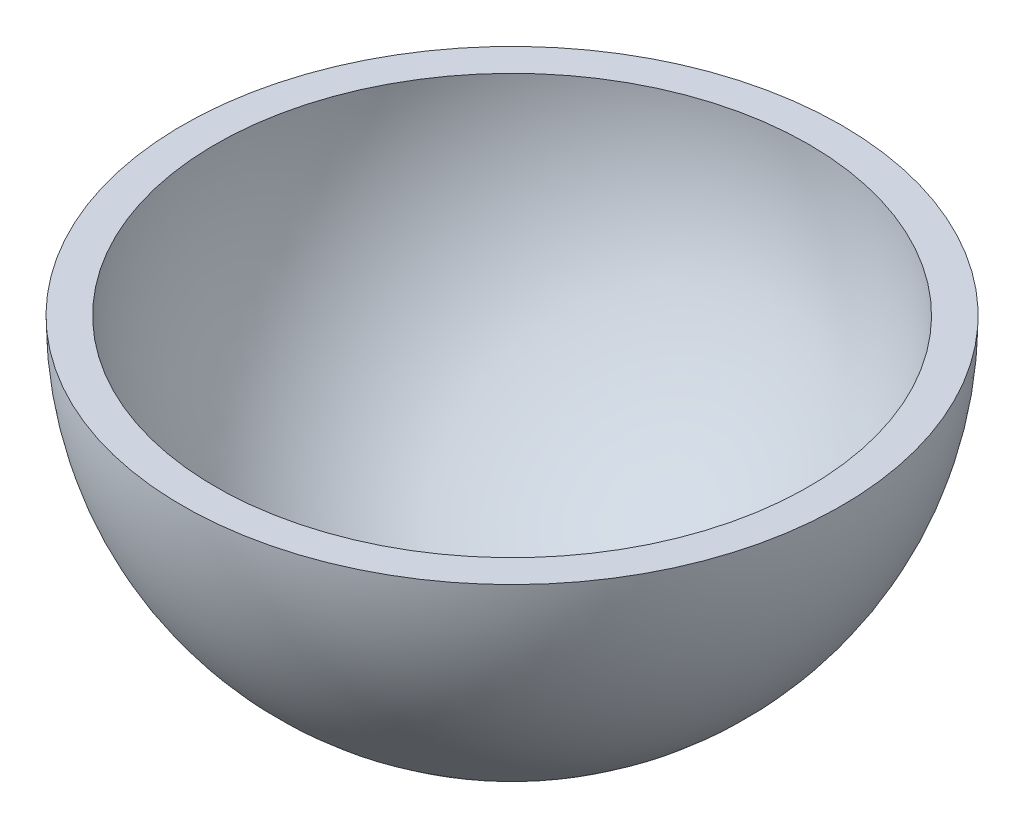
ISO-10303-21;
HEADER;
FILE_DESCRIPTION(('STEP AP214'),'2;1');
FILE_NAME('part.step','',(''),(''),'','','');
FILE_SCHEMA(('AUTOMOTIVE_DESIGN { 1 0 10303 214 1 1 1 1 }'));
ENDSEC;
DATA;
#1=APPLICATION_CONTEXT('core data for automotive mechanical design processes');
#2=APPLICATION_PROTOCOL_DEFINITION('international standard','automotive_design',2000,#1);
#3=PRODUCT_CONTEXT('',#1,'mechanical');
#4=PRODUCT('Part','Part','',(#3));
#5=PRODUCT_RELATED_PRODUCT_CATEGORY('part','',(#4));
#6=PRODUCT_DEFINITION_FORMATION('','',#4);
#7=PRODUCT_DEFINITION_CONTEXT('part definition',#1,'design');
#8=PRODUCT_DEFINITION('design','',#6,#7);
#9=PRODUCT_DEFINITION_SHAPE('','',#8);
#10=(LENGTH_UNIT() NAMED_UNIT(*) SI_UNIT(.MILLI.,.METRE.));
#11=(NAMED_UNIT(*) PLANE_ANGLE_UNIT() SI_UNIT($,.RADIAN.));
#12=(NAMED_UNIT(*) SI_UNIT($,.STERADIAN.) SOLID_ANGLE_UNIT());
#13=UNCERTAINTY_MEASURE_WITH_UNIT(LENGTH_MEASURE(1.E-05),#10,'distance_accuracy_value','');
#14=(GEOMETRIC_REPRESENTATION_CONTEXT(3) GLOBAL_UNCERTAINTY_ASSIGNED_CONTEXT((#13)) GLOBAL_UNIT_ASSIGNED_CONTEXT((#10,
#11,#12)) REPRESENTATION_CONTEXT('',''));
#15=CARTESIAN_POINT('',(0.,0.,0.));
#16=DIRECTION('',(0.,0.,1.));
#17=DIRECTION('',(1.,0.,0.));
#18=AXIS2_PLACEMENT_3D('',#15,#16,#17);
#19=CARTESIAN_POINT('',(0.,0.,0.));
#20=DIRECTION('',(1.,0.,0.));
#21=DIRECTION('',(0.,0.,-1.));
#22=AXIS2_PLACEMENT_3D('',#19,#20,#21);
#23=SPHERICAL_SURFACE('',#22,25.);
#24=CARTESIAN_POINT('',(0.,0.,0.));
#25=DIRECTION('',(0.,-1.,0.));
#26=DIRECTION('',(0.,0.,-1.));
#27=AXIS2_PLACEMENT_3D('',#24,#25,#26);
#28=SPHERICAL_SURFACE('',#27,25.);
#29=CARTESIAN_POINT('',(0.,0.,0.));
#30=DIRECTION('',(0.,-1.,0.));
#31=DIRECTION('',(0.,0.,-1.));
#32=AXIS2_PLACEMENT_3D('',#29,#30,#31);
#33=CIRCLE('',#32,25.);
#34=CARTESIAN_POINT('',(0.,-1.74574066942157E-13,-25.));
#35=VERTEX_POINT('',#34);
#36=EDGE_CURVE('E45',#35,#35,#33,.T.);
#37=ORIENTED_EDGE('',*,*,#36,.T.);
#38=EDGE_LOOP('',(#37));
#39=FACE_BOUND('',#38,.T.);
#40=ADVANCED_FACE('F37',(#39),#28,.T.);
#41=CARTESIAN_POINT('',(0.,0.,0.));
#42=DIRECTION('',(1.,0.,0.));
#43=DIRECTION('',(0.,0.,1.));
#44=AXIS2_PLACEMENT_3D('',#41,#42,#43);
#45=SPHERICAL_SURFACE('',#44,22.5);
#46=CARTESIAN_POINT('',(0.,0.,0.));
#47=DIRECTION('',(0.,1.,0.));
#48=DIRECTION('',(0.,0.,-1.));
#49=AXIS2_PLACEMENT_3D('',#46,#47,#48);
#50=SPHERICAL_SURFACE('',#49,22.5);
#51=CARTESIAN_POINT('',(0.,0.,0.));
#52=DIRECTION('',(0.,1.,0.));
#53=DIRECTION('',(0.,0.,-1.));
#54=AXIS2_PLACEMENT_3D('',#51,#52,#53);
#55=CIRCLE('',#54,22.5);
#56=CARTESIAN_POINT('',(0.,-1.57116660247941E-13,-22.5));
#57=VERTEX_POINT('',#56);
#58=EDGE_CURVE('E10',#57,#57,#55,.T.);
#59=ORIENTED_EDGE('',*,*,#58,.T.);
#60=EDGE_LOOP('',(#59));
#61=FACE_BOUND('',#60,.T.);
#62=ADVANCED_FACE('F39',(#61),#50,.F.);
#63=CARTESIAN_POINT('',(0.,0.,0.));
#64=DIRECTION('',(0.,-1.,0.));
#65=DIRECTION('',(0.,0.,-1.));
#66=AXIS2_PLACEMENT_3D('',#63,#64,#65);
#67=PLANE('',#66);
#68=ORIENTED_EDGE('',*,*,#58,.F.);
#69=EDGE_LOOP('',(#68));
#70=FACE_BOUND('',#69,.T.);
#71=ORIENTED_EDGE('',*,*,#36,.F.);
#72=EDGE_LOOP('',(#71));
#73=FACE_BOUND('',#72,.T.);
#74=ADVANCED_FACE('F53',(#70,#73),#67,.F.);
#75=CLOSED_SHELL('',(#40,#62,#74));
#76=MANIFOLD_SOLID_BREP('B2',#75);
#77=ADVANCED_BREP_SHAPE_REPRESENTATION('',(#18,#76),#14);
#78=SHAPE_DEFINITION_REPRESENTATION(#9,#77);
ENDSEC;
END-ISO-10303-21;
